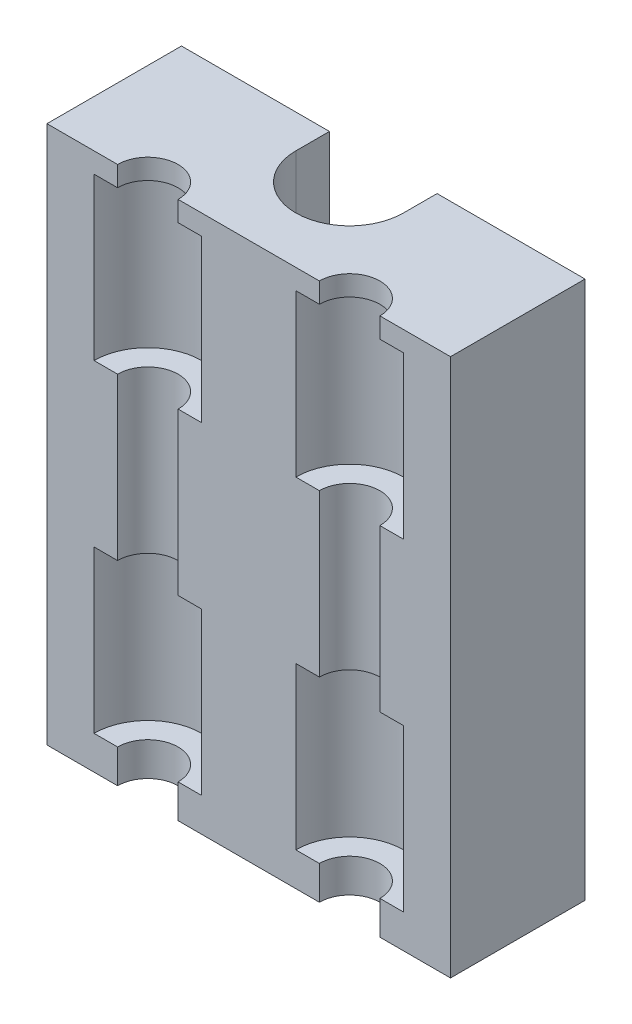
ISO-10303-21;
HEADER;
FILE_DESCRIPTION(('STEP AP214'),'2;1');
FILE_NAME('part.step','',(''),(''),'','','');
FILE_SCHEMA(('AUTOMOTIVE_DESIGN { 1 0 10303 214 1 1 1 1 }'));
ENDSEC;
DATA;
#1=APPLICATION_CONTEXT('core data for automotive mechanical design processes');
#2=APPLICATION_PROTOCOL_DEFINITION('international standard','automotive_design',2000,#1);
#3=PRODUCT_CONTEXT('',#1,'mechanical');
#4=PRODUCT('Part','Part','',(#3));
#5=PRODUCT_RELATED_PRODUCT_CATEGORY('part','',(#4));
#6=PRODUCT_DEFINITION_FORMATION('','',#4);
#7=PRODUCT_DEFINITION_CONTEXT('part definition',#1,'design');
#8=PRODUCT_DEFINITION('design','',#6,#7);
#9=PRODUCT_DEFINITION_SHAPE('','',#8);
#10=(LENGTH_UNIT() NAMED_UNIT(*) SI_UNIT(.MILLI.,.METRE.));
#11=(NAMED_UNIT(*) PLANE_ANGLE_UNIT() SI_UNIT($,.RADIAN.));
#12=(NAMED_UNIT(*) SI_UNIT($,.STERADIAN.) SOLID_ANGLE_UNIT());
#13=UNCERTAINTY_MEASURE_WITH_UNIT(LENGTH_MEASURE(1.E-05),#10,'distance_accuracy_value','');
#14=(GEOMETRIC_REPRESENTATION_CONTEXT(3) GLOBAL_UNCERTAINTY_ASSIGNED_CONTEXT((#13)) GLOBAL_UNIT_ASSIGNED_CONTEXT((#10,
#11,#12)) REPRESENTATION_CONTEXT('',''));
#15=CARTESIAN_POINT('',(0.,0.,0.));
#16=DIRECTION('',(0.,0.,1.));
#17=DIRECTION('',(1.,0.,0.));
#18=AXIS2_PLACEMENT_3D('',#15,#16,#17);
#19=CARTESIAN_POINT('',(-15.,-40.,-10.));
#20=DIRECTION('',(0.,0.,-1.));
#21=DIRECTION('',(-1.,0.,0.));
#22=AXIS2_PLACEMENT_3D('',#19,#20,#21);
#23=PLANE('',#22);
#24=DIRECTION('',(0.,1.,0.));
#25=VECTOR('',#24,1.);
#26=CARTESIAN_POINT('',(-4.,-40.,-10.));
#27=LINE('',#26,#25);
#28=CARTESIAN_POINT('',(-4.,-40.,-10.));
#29=VERTEX_POINT('',#28);
#30=CARTESIAN_POINT('',(-4.,0.,-10.));
#31=VERTEX_POINT('',#30);
#32=EDGE_CURVE('E251',#29,#31,#27,.T.);
#33=ORIENTED_EDGE('',*,*,#32,.F.);
#34=DIRECTION('',(-1.,0.,0.));
#35=VECTOR('',#34,1.);
#36=CARTESIAN_POINT('',(-15.,-40.,-10.));
#37=LINE('',#36,#35);
#38=CARTESIAN_POINT('',(-15.,-40.,-10.));
#39=VERTEX_POINT('',#38);
#40=EDGE_CURVE('E346',#29,#39,#37,.T.);
#41=ORIENTED_EDGE('',*,*,#40,.T.);
#42=DIRECTION('',(0.,1.,0.));
#43=VECTOR('',#42,1.);
#44=CARTESIAN_POINT('',(-15.,-40.,-10.));
#45=LINE('',#44,#43);
#46=CARTESIAN_POINT('',(-15.,0.,-10.));
#47=VERTEX_POINT('',#46);
#48=EDGE_CURVE('E378',#39,#47,#45,.T.);
#49=ORIENTED_EDGE('',*,*,#48,.T.);
#50=DIRECTION('',(-1.,0.,0.));
#51=VECTOR('',#50,1.);
#52=CARTESIAN_POINT('',(-15.,0.,-10.));
#53=LINE('',#52,#51);
#54=EDGE_CURVE('E361',#31,#47,#53,.T.);
#55=ORIENTED_EDGE('',*,*,#54,.F.);
#56=EDGE_LOOP('',(#33,#41,#49,#55));
#57=FACE_BOUND('',#56,.T.);
#58=ADVANCED_FACE('F35',(#57),#23,.T.);
#59=CARTESIAN_POINT('',(-15.,-40.,0.));
#60=DIRECTION('',(0.,0.,1.));
#61=DIRECTION('',(1.,0.,0.));
#62=AXIS2_PLACEMENT_3D('',#59,#60,#61);
#63=PLANE('',#62);
#64=DIRECTION('',(0.,1.,0.));
#65=VECTOR('',#64,1.);
#66=CARTESIAN_POINT('',(-5.25,-40.,0.));
#67=LINE('',#66,#65);
#68=CARTESIAN_POINT('',(-5.25,-40.,0.));
#69=VERTEX_POINT('',#68);
#70=CARTESIAN_POINT('',(-5.25,-37.5,0.));
#71=VERTEX_POINT('',#70);
#72=EDGE_CURVE('E285',#69,#71,#67,.T.);
#73=ORIENTED_EDGE('',*,*,#72,.F.);
#74=DIRECTION('',(1.,0.,0.));
#75=VECTOR('',#74,1.);
#76=CARTESIAN_POINT('',(-15.,-40.,0.));
#77=LINE('',#76,#75);
#78=CARTESIAN_POINT('',(5.25,-40.,0.));
#79=VERTEX_POINT('',#78);
#80=EDGE_CURVE('E358',#69,#79,#77,.T.);
#81=ORIENTED_EDGE('',*,*,#80,.T.);
#82=DIRECTION('',(0.,1.,0.));
#83=VECTOR('',#82,1.);
#84=CARTESIAN_POINT('',(5.25,-40.,0.));
#85=LINE('',#84,#83);
#86=CARTESIAN_POINT('',(5.25,-37.5,0.));
#87=VERTEX_POINT('',#86);
#88=EDGE_CURVE('E266',#87,#79,#85,.F.);
#89=ORIENTED_EDGE('',*,*,#88,.F.);
#90=DIRECTION('',(1.,0.,0.));
#91=VECTOR('',#90,1.);
#92=CARTESIAN_POINT('',(3.5,-37.5,0.));
#93=LINE('',#92,#91);
#94=CARTESIAN_POINT('',(3.5,-37.5,0.));
#95=VERTEX_POINT('',#94);
#96=EDGE_CURVE('E297',#95,#87,#93,.T.);
#97=ORIENTED_EDGE('',*,*,#96,.F.);
#98=DIRECTION('',(0.,1.,0.));
#99=VECTOR('',#98,1.);
#100=CARTESIAN_POINT('',(3.5,-37.5,0.));
#101=LINE('',#100,#99);
#102=CARTESIAN_POINT('',(3.5,-25.5,0.));
#103=VERTEX_POINT('',#102);
#104=EDGE_CURVE('E300',#95,#103,#101,.T.);
#105=ORIENTED_EDGE('',*,*,#104,.T.);
#106=DIRECTION('',(1.,0.,0.));
#107=VECTOR('',#106,1.);
#108=CARTESIAN_POINT('',(3.5,-25.5,0.));
#109=LINE('',#108,#107);
#110=CARTESIAN_POINT('',(5.25,-25.5,0.));
#111=VERTEX_POINT('',#110);
#112=EDGE_CURVE('E296',#103,#111,#109,.T.);
#113=ORIENTED_EDGE('',*,*,#112,.T.);
#114=CARTESIAN_POINT('',(5.25,-13.5,0.));
#115=VERTEX_POINT('',#114);
#116=EDGE_CURVE('E260',#115,#111,#85,.F.);
#117=ORIENTED_EDGE('',*,*,#116,.F.);
#118=DIRECTION('',(1.,0.,0.));
#119=VECTOR('',#118,1.);
#120=CARTESIAN_POINT('',(-15.,-13.5,0.));
#121=LINE('',#120,#119);
#122=CARTESIAN_POINT('',(3.5,-13.5,0.));
#123=VERTEX_POINT('',#122);
#124=EDGE_CURVE('E391',#123,#115,#121,.T.);
#125=ORIENTED_EDGE('',*,*,#124,.F.);
#126=DIRECTION('',(0.,1.,0.));
#127=VECTOR('',#126,1.);
#128=CARTESIAN_POINT('',(3.5,-13.5,0.));
#129=LINE('',#128,#127);
#130=CARTESIAN_POINT('',(3.5,-1.5,0.));
#131=VERTEX_POINT('',#130);
#132=EDGE_CURVE('E385',#131,#123,#129,.F.);
#133=ORIENTED_EDGE('',*,*,#132,.F.);
#134=DIRECTION('',(1.,0.,0.));
#135=VECTOR('',#134,1.);
#136=CARTESIAN_POINT('',(-15.,-1.5,0.));
#137=LINE('',#136,#135);
#138=CARTESIAN_POINT('',(5.25,-1.5,0.));
#139=VERTEX_POINT('',#138);
#140=EDGE_CURVE('E382',#131,#139,#137,.T.);
#141=ORIENTED_EDGE('',*,*,#140,.T.);
#142=CARTESIAN_POINT('',(5.25,0.,0.));
#143=VERTEX_POINT('',#142);
#144=EDGE_CURVE('E58',#143,#139,#85,.F.);
#145=ORIENTED_EDGE('',*,*,#144,.F.);
#146=DIRECTION('',(1.,0.,0.));
#147=VECTOR('',#146,1.);
#148=CARTESIAN_POINT('',(-15.,0.,0.));
#149=LINE('',#148,#147);
#150=CARTESIAN_POINT('',(-5.25,0.,0.));
#151=VERTEX_POINT('',#150);
#152=EDGE_CURVE('E371',#151,#143,#149,.T.);
#153=ORIENTED_EDGE('',*,*,#152,.F.);
#154=CARTESIAN_POINT('',(-5.25,-1.5,0.));
#155=VERTEX_POINT('',#154);
#156=EDGE_CURVE('E284',#155,#151,#67,.T.);
#157=ORIENTED_EDGE('',*,*,#156,.F.);
#158=DIRECTION('',(-1.,0.,0.));
#159=VECTOR('',#158,1.);
#160=CARTESIAN_POINT('',(-15.,-1.5,0.));
#161=LINE('',#160,#159);
#162=CARTESIAN_POINT('',(-3.5,-1.5,0.));
#163=VERTEX_POINT('',#162);
#164=EDGE_CURVE('E395',#163,#155,#161,.T.);
#165=ORIENTED_EDGE('',*,*,#164,.F.);
#166=DIRECTION('',(0.,1.,0.));
#167=VECTOR('',#166,1.);
#168=CARTESIAN_POINT('',(-3.5,-13.5,0.));
#169=LINE('',#168,#167);
#170=CARTESIAN_POINT('',(-3.5,-13.5,0.));
#171=VERTEX_POINT('',#170);
#172=EDGE_CURVE('E401',#171,#163,#169,.T.);
#173=ORIENTED_EDGE('',*,*,#172,.F.);
#174=DIRECTION('',(-1.,0.,0.));
#175=VECTOR('',#174,1.);
#176=CARTESIAN_POINT('',(-15.,-13.5,0.));
#177=LINE('',#176,#175);
#178=CARTESIAN_POINT('',(-5.25,-13.5,0.));
#179=VERTEX_POINT('',#178);
#180=EDGE_CURVE('E405',#171,#179,#177,.T.);
#181=ORIENTED_EDGE('',*,*,#180,.T.);
#182=CARTESIAN_POINT('',(-5.25,-25.5,0.));
#183=VERTEX_POINT('',#182);
#184=EDGE_CURVE('E279',#183,#179,#67,.T.);
#185=ORIENTED_EDGE('',*,*,#184,.F.);
#186=DIRECTION('',(1.,0.,0.));
#187=VECTOR('',#186,1.);
#188=CARTESIAN_POINT('',(-11.5,-25.5,0.));
#189=LINE('',#188,#187);
#190=CARTESIAN_POINT('',(-3.5,-25.5,0.));
#191=VERTEX_POINT('',#190);
#192=EDGE_CURVE('E324',#183,#191,#189,.T.);
#193=ORIENTED_EDGE('',*,*,#192,.T.);
#194=DIRECTION('',(0.,1.,0.));
#195=VECTOR('',#194,1.);
#196=CARTESIAN_POINT('',(-3.5,-37.5,0.));
#197=LINE('',#196,#195);
#198=CARTESIAN_POINT('',(-3.5,-37.5,0.));
#199=VERTEX_POINT('',#198);
#200=EDGE_CURVE('E304',#199,#191,#197,.T.);
#201=ORIENTED_EDGE('',*,*,#200,.F.);
#202=DIRECTION('',(1.,0.,0.));
#203=VECTOR('',#202,1.);
#204=CARTESIAN_POINT('',(-11.5,-37.5,0.));
#205=LINE('',#204,#203);
#206=EDGE_CURVE('E316',#71,#199,#205,.T.);
#207=ORIENTED_EDGE('',*,*,#206,.F.);
#208=EDGE_LOOP('',(#73,#81,#89,#97,#105,#113,#117,#125,#133,#141,#145,#153,#157,#165,#173,#181,
#185,#193,#201,#207));
#209=FACE_BOUND('',#208,.T.);
#210=ADVANCED_FACE('F418',(#209),#63,.T.);
#211=DIRECTION('',(0.,1.,0.));
#212=VECTOR('',#211,1.);
#213=CARTESIAN_POINT('',(9.75,-40.,0.));
#214=LINE('',#213,#212);
#215=CARTESIAN_POINT('',(9.75,-40.,0.));
#216=VERTEX_POINT('',#215);
#217=CARTESIAN_POINT('',(9.75,-37.5,0.));
#218=VERTEX_POINT('',#217);
#219=EDGE_CURVE('E270',#216,#218,#214,.T.);
#220=ORIENTED_EDGE('',*,*,#219,.F.);
#221=CARTESIAN_POINT('',(15.,-40.,0.));
#222=VERTEX_POINT('',#221);
#223=EDGE_CURVE('E353',#216,#222,#77,.T.);
#224=ORIENTED_EDGE('',*,*,#223,.T.);
#225=DIRECTION('',(0.,1.,0.));
#226=VECTOR('',#225,1.);
#227=CARTESIAN_POINT('',(15.,-40.,0.));
#228=LINE('',#227,#226);
#229=CARTESIAN_POINT('',(15.,0.,0.));
#230=VERTEX_POINT('',#229);
#231=EDGE_CURVE('E372',#222,#230,#228,.T.);
#232=ORIENTED_EDGE('',*,*,#231,.T.);
#233=CARTESIAN_POINT('',(9.75,0.,0.));
#234=VERTEX_POINT('',#233);
#235=EDGE_CURVE('E368',#234,#230,#149,.T.);
#236=ORIENTED_EDGE('',*,*,#235,.F.);
#237=CARTESIAN_POINT('',(9.75,-1.5,0.));
#238=VERTEX_POINT('',#237);
#239=EDGE_CURVE('E269',#238,#234,#214,.T.);
#240=ORIENTED_EDGE('',*,*,#239,.F.);
#241=CARTESIAN_POINT('',(11.5,-1.5,0.));
#242=VERTEX_POINT('',#241);
#243=EDGE_CURVE('E375',#238,#242,#137,.T.);
#244=ORIENTED_EDGE('',*,*,#243,.T.);
#245=DIRECTION('',(0.,1.,0.));
#246=VECTOR('',#245,1.);
#247=CARTESIAN_POINT('',(11.5,-13.5,0.));
#248=LINE('',#247,#246);
#249=CARTESIAN_POINT('',(11.5,-13.5,0.));
#250=VERTEX_POINT('',#249);
#251=EDGE_CURVE('E387',#250,#242,#248,.T.);
#252=ORIENTED_EDGE('',*,*,#251,.F.);
#253=CARTESIAN_POINT('',(9.75,-13.5,0.));
#254=VERTEX_POINT('',#253);
#255=EDGE_CURVE('E390',#254,#250,#121,.T.);
#256=ORIENTED_EDGE('',*,*,#255,.F.);
#257=CARTESIAN_POINT('',(9.75,-25.5,0.));
#258=VERTEX_POINT('',#257);
#259=EDGE_CURVE('E265',#258,#254,#214,.T.);
#260=ORIENTED_EDGE('',*,*,#259,.F.);
#261=CARTESIAN_POINT('',(11.5,-25.5,0.));
#262=VERTEX_POINT('',#261);
#263=EDGE_CURVE('E303',#258,#262,#109,.T.);
#264=ORIENTED_EDGE('',*,*,#263,.T.);
#265=DIRECTION('',(0.,1.,0.));
#266=VECTOR('',#265,1.);
#267=CARTESIAN_POINT('',(11.5,-37.5,0.));
#268=LINE('',#267,#266);
#269=CARTESIAN_POINT('',(11.5,-37.5,0.));
#270=VERTEX_POINT('',#269);
#271=EDGE_CURVE('E307',#270,#262,#268,.T.);
#272=ORIENTED_EDGE('',*,*,#271,.F.);
#273=EDGE_CURVE('E295',#218,#270,#93,.T.);
#274=ORIENTED_EDGE('',*,*,#273,.F.);
#275=EDGE_LOOP('',(#220,#224,#232,#236,#240,#244,#252,#256,#260,#264,#272,#274));
#276=FACE_BOUND('',#275,.T.);
#277=ADVANCED_FACE('F432',(#276),#63,.T.);
#278=DIRECTION('',(0.,1.,0.));
#279=VECTOR('',#278,1.);
#280=CARTESIAN_POINT('',(-9.75,-40.,0.));
#281=LINE('',#280,#279);
#282=CARTESIAN_POINT('',(-9.75,0.,0.));
#283=VERTEX_POINT('',#282);
#284=CARTESIAN_POINT('',(-9.75,-1.5,0.));
#285=VERTEX_POINT('',#284);
#286=EDGE_CURVE('E280',#283,#285,#281,.F.);
#287=ORIENTED_EDGE('',*,*,#286,.F.);
#288=CARTESIAN_POINT('',(-15.,0.,0.));
#289=VERTEX_POINT('',#288);
#290=EDGE_CURVE('E347',#289,#283,#149,.T.);
#291=ORIENTED_EDGE('',*,*,#290,.F.);
#292=DIRECTION('',(0.,1.,0.));
#293=VECTOR('',#292,1.);
#294=CARTESIAN_POINT('',(-15.,-40.,0.));
#295=LINE('',#294,#293);
#296=CARTESIAN_POINT('',(-15.,-40.,0.));
#297=VERTEX_POINT('',#296);
#298=EDGE_CURVE('E376',#297,#289,#295,.T.);
#299=ORIENTED_EDGE('',*,*,#298,.F.);
#300=CARTESIAN_POINT('',(-9.75,-40.,0.));
#301=VERTEX_POINT('',#300);
#302=EDGE_CURVE('E354',#297,#301,#77,.T.);
#303=ORIENTED_EDGE('',*,*,#302,.T.);
#304=CARTESIAN_POINT('',(-9.75,-37.5,0.));
#305=VERTEX_POINT('',#304);
#306=EDGE_CURVE('E281',#305,#301,#281,.F.);
#307=ORIENTED_EDGE('',*,*,#306,.F.);
#308=CARTESIAN_POINT('',(-11.5,-37.5,0.));
#309=VERTEX_POINT('',#308);
#310=EDGE_CURVE('E318',#309,#305,#205,.T.);
#311=ORIENTED_EDGE('',*,*,#310,.F.);
#312=DIRECTION('',(0.,1.,0.));
#313=VECTOR('',#312,1.);
#314=CARTESIAN_POINT('',(-11.5,-37.5,0.));
#315=LINE('',#314,#313);
#316=CARTESIAN_POINT('',(-11.5,-25.5,0.));
#317=VERTEX_POINT('',#316);
#318=EDGE_CURVE('E321',#309,#317,#315,.T.);
#319=ORIENTED_EDGE('',*,*,#318,.T.);
#320=CARTESIAN_POINT('',(-9.75,-25.5,0.));
#321=VERTEX_POINT('',#320);
#322=EDGE_CURVE('E317',#317,#321,#189,.T.);
#323=ORIENTED_EDGE('',*,*,#322,.T.);
#324=CARTESIAN_POINT('',(-9.75,-13.5,0.));
#325=VERTEX_POINT('',#324);
#326=EDGE_CURVE('E277',#325,#321,#281,.F.);
#327=ORIENTED_EDGE('',*,*,#326,.F.);
#328=CARTESIAN_POINT('',(-11.5,-13.5,0.));
#329=VERTEX_POINT('',#328);
#330=EDGE_CURVE('E404',#325,#329,#177,.T.);
#331=ORIENTED_EDGE('',*,*,#330,.T.);
#332=DIRECTION('',(0.,1.,0.));
#333=VECTOR('',#332,1.);
#334=CARTESIAN_POINT('',(-11.5,-13.5,0.));
#335=LINE('',#334,#333);
#336=CARTESIAN_POINT('',(-11.5,-1.5,0.));
#337=VERTEX_POINT('',#336);
#338=EDGE_CURVE('E398',#337,#329,#335,.F.);
#339=ORIENTED_EDGE('',*,*,#338,.F.);
#340=EDGE_CURVE('E394',#285,#337,#161,.T.);
#341=ORIENTED_EDGE('',*,*,#340,.F.);
#342=EDGE_LOOP('',(#287,#291,#299,#303,#307,#311,#319,#323,#327,#331,#339,#341));
#343=FACE_BOUND('',#342,.T.);
#344=ADVANCED_FACE('F491',(#343),#63,.T.);
#345=CARTESIAN_POINT('',(15.,-40.,-10.));
#346=DIRECTION('',(1.,0.,0.));
#347=DIRECTION('',(0.,0.,-1.));
#348=AXIS2_PLACEMENT_3D('',#345,#346,#347);
#349=PLANE('',#348);
#350=DIRECTION('',(0.,0.,-1.));
#351=VECTOR('',#350,1.);
#352=CARTESIAN_POINT('',(15.,0.,-10.));
#353=LINE('',#352,#351);
#354=CARTESIAN_POINT('',(15.,0.,-10.));
#355=VERTEX_POINT('',#354);
#356=EDGE_CURVE('E334',#230,#355,#353,.T.);
#357=ORIENTED_EDGE('',*,*,#356,.F.);
#358=ORIENTED_EDGE('',*,*,#231,.F.);
#359=DIRECTION('',(0.,0.,-1.));
#360=VECTOR('',#359,1.);
#361=CARTESIAN_POINT('',(15.,-40.,-10.));
#362=LINE('',#361,#360);
#363=CARTESIAN_POINT('',(15.,-40.,-10.));
#364=VERTEX_POINT('',#363);
#365=EDGE_CURVE('E343',#222,#364,#362,.T.);
#366=ORIENTED_EDGE('',*,*,#365,.T.);
#367=DIRECTION('',(0.,1.,0.));
#368=VECTOR('',#367,1.);
#369=CARTESIAN_POINT('',(15.,-40.,-10.));
#370=LINE('',#369,#368);
#371=EDGE_CURVE('E357',#364,#355,#370,.T.);
#372=ORIENTED_EDGE('',*,*,#371,.T.);
#373=EDGE_LOOP('',(#357,#358,#366,#372));
#374=FACE_BOUND('',#373,.T.);
#375=ADVANCED_FACE('F37',(#374),#349,.T.);
#376=CARTESIAN_POINT('',(-15.,-40.,-10.));
#377=DIRECTION('',(-1.,0.,0.));
#378=DIRECTION('',(0.,0.,1.));
#379=AXIS2_PLACEMENT_3D('',#376,#377,#378);
#380=PLANE('',#379);
#381=DIRECTION('',(0.,0.,1.));
#382=VECTOR('',#381,1.);
#383=CARTESIAN_POINT('',(-15.,0.,-10.));
#384=LINE('',#383,#382);
#385=EDGE_CURVE('E365',#47,#289,#384,.T.);
#386=ORIENTED_EDGE('',*,*,#385,.F.);
#387=ORIENTED_EDGE('',*,*,#48,.F.);
#388=DIRECTION('',(0.,0.,1.));
#389=VECTOR('',#388,1.);
#390=CARTESIAN_POINT('',(-15.,-40.,-10.));
#391=LINE('',#390,#389);
#392=EDGE_CURVE('E350',#39,#297,#391,.T.);
#393=ORIENTED_EDGE('',*,*,#392,.T.);
#394=ORIENTED_EDGE('',*,*,#298,.T.);
#395=EDGE_LOOP('',(#386,#387,#393,#394));
#396=FACE_BOUND('',#395,.T.);
#397=ADVANCED_FACE('F513',(#396),#380,.T.);
#398=DIRECTION('',(0.,1.,0.));
#399=VECTOR('',#398,1.);
#400=CARTESIAN_POINT('',(4.,-40.,-10.));
#401=LINE('',#400,#399);
#402=CARTESIAN_POINT('',(4.,-40.,-10.));
#403=VERTEX_POINT('',#402);
#404=CARTESIAN_POINT('',(4.,0.,-10.));
#405=VERTEX_POINT('',#404);
#406=EDGE_CURVE('E226',#403,#405,#401,.T.);
#407=ORIENTED_EDGE('',*,*,#406,.T.);
#408=EDGE_CURVE('E362',#355,#405,#53,.T.);
#409=ORIENTED_EDGE('',*,*,#408,.F.);
#410=ORIENTED_EDGE('',*,*,#371,.F.);
#411=EDGE_CURVE('E348',#364,#403,#37,.T.);
#412=ORIENTED_EDGE('',*,*,#411,.T.);
#413=EDGE_LOOP('',(#407,#409,#410,#412));
#414=FACE_BOUND('',#413,.T.);
#415=ADVANCED_FACE('F461',(#414),#23,.T.);
#416=CARTESIAN_POINT('',(0.,-40.,0.));
#417=DIRECTION('',(0.,1.,0.));
#418=DIRECTION('',(0.,0.,1.));
#419=AXIS2_PLACEMENT_3D('',#416,#417,#418);
#420=PLANE('',#419);
#421=ORIENTED_EDGE('',*,*,#40,.F.);
#422=DIRECTION('',(0.,0.,1.));
#423=VECTOR('',#422,1.);
#424=CARTESIAN_POINT('',(-4.,-40.,-7.5));
#425=LINE('',#424,#423);
#426=CARTESIAN_POINT('',(-4.,-40.,-7.5));
#427=VERTEX_POINT('',#426);
#428=EDGE_CURVE('E227',#29,#427,#425,.T.);
#429=ORIENTED_EDGE('',*,*,#428,.T.);
#430=CARTESIAN_POINT('',(0.,-40.,-7.5));
#431=DIRECTION('',(0.,1.,0.));
#432=DIRECTION('',(0.,0.,1.));
#433=AXIS2_PLACEMENT_3D('',#430,#431,#432);
#434=CIRCLE('',#433,4.);
#435=CARTESIAN_POINT('',(4.,-40.,-7.5));
#436=VERTEX_POINT('',#435);
#437=EDGE_CURVE('E222',#427,#436,#434,.T.);
#438=ORIENTED_EDGE('',*,*,#437,.T.);
#439=DIRECTION('',(0.,0.,-1.));
#440=VECTOR('',#439,1.);
#441=CARTESIAN_POINT('',(4.,-40.,-7.5));
#442=LINE('',#441,#440);
#443=EDGE_CURVE('E230',#436,#403,#442,.T.);
#444=ORIENTED_EDGE('',*,*,#443,.T.);
#445=ORIENTED_EDGE('',*,*,#411,.F.);
#446=ORIENTED_EDGE('',*,*,#365,.F.);
#447=ORIENTED_EDGE('',*,*,#223,.F.);
#448=CARTESIAN_POINT('',(7.5,-40.,0.));
#449=DIRECTION('',(0.,1.,0.));
#450=DIRECTION('',(0.,0.,1.));
#451=AXIS2_PLACEMENT_3D('',#448,#449,#450);
#452=CIRCLE('',#451,2.25);
#453=EDGE_CURVE('E257',#216,#79,#452,.T.);
#454=ORIENTED_EDGE('',*,*,#453,.T.);
#455=ORIENTED_EDGE('',*,*,#80,.F.);
#456=CARTESIAN_POINT('',(-7.5,-40.,0.));
#457=DIRECTION('',(0.,1.,0.));
#458=DIRECTION('',(0.,0.,1.));
#459=AXIS2_PLACEMENT_3D('',#456,#457,#458);
#460=CIRCLE('',#459,2.25);
#461=EDGE_CURVE('E256',#69,#301,#460,.T.);
#462=ORIENTED_EDGE('',*,*,#461,.T.);
#463=ORIENTED_EDGE('',*,*,#302,.F.);
#464=ORIENTED_EDGE('',*,*,#392,.F.);
#465=EDGE_LOOP('',(#421,#429,#438,#444,#445,#446,#447,#454,#455,#462,#463,#464));
#466=FACE_BOUND('',#465,.T.);
#467=ADVANCED_FACE('F238',(#466),#420,.F.);
#468=CARTESIAN_POINT('',(0.,0.,0.));
#469=DIRECTION('',(0.,1.,0.));
#470=DIRECTION('',(0.,0.,1.));
#471=AXIS2_PLACEMENT_3D('',#468,#469,#470);
#472=PLANE('',#471);
#473=DIRECTION('',(0.,0.,1.));
#474=VECTOR('',#473,1.);
#475=CARTESIAN_POINT('',(-4.,0.,-7.5));
#476=LINE('',#475,#474);
#477=CARTESIAN_POINT('',(-4.,0.,-7.5));
#478=VERTEX_POINT('',#477);
#479=EDGE_CURVE('E239',#31,#478,#476,.T.);
#480=ORIENTED_EDGE('',*,*,#479,.F.);
#481=ORIENTED_EDGE('',*,*,#54,.T.);
#482=ORIENTED_EDGE('',*,*,#385,.T.);
#483=ORIENTED_EDGE('',*,*,#290,.T.);
#484=CARTESIAN_POINT('',(-7.5,0.,0.));
#485=DIRECTION('',(0.,1.,0.));
#486=DIRECTION('',(0.,0.,1.));
#487=AXIS2_PLACEMENT_3D('',#484,#485,#486);
#488=CIRCLE('',#487,2.25);
#489=EDGE_CURVE('E254',#151,#283,#488,.T.);
#490=ORIENTED_EDGE('',*,*,#489,.F.);
#491=ORIENTED_EDGE('',*,*,#152,.T.);
#492=CARTESIAN_POINT('',(7.5,0.,0.));
#493=DIRECTION('',(0.,1.,0.));
#494=DIRECTION('',(0.,0.,1.));
#495=AXIS2_PLACEMENT_3D('',#492,#493,#494);
#496=CIRCLE('',#495,2.25);
#497=EDGE_CURVE('E250',#234,#143,#496,.T.);
#498=ORIENTED_EDGE('',*,*,#497,.F.);
#499=ORIENTED_EDGE('',*,*,#235,.T.);
#500=ORIENTED_EDGE('',*,*,#356,.T.);
#501=ORIENTED_EDGE('',*,*,#408,.T.);
#502=DIRECTION('',(0.,0.,-1.));
#503=VECTOR('',#502,1.);
#504=CARTESIAN_POINT('',(4.,0.,-7.5));
#505=LINE('',#504,#503);
#506=CARTESIAN_POINT('',(4.,0.,-7.5));
#507=VERTEX_POINT('',#506);
#508=EDGE_CURVE('E242',#507,#405,#505,.T.);
#509=ORIENTED_EDGE('',*,*,#508,.F.);
#510=CARTESIAN_POINT('',(0.,0.,-7.5));
#511=DIRECTION('',(0.,1.,0.));
#512=DIRECTION('',(0.,0.,1.));
#513=AXIS2_PLACEMENT_3D('',#510,#511,#512);
#514=CIRCLE('',#513,4.);
#515=EDGE_CURVE('E50',#478,#507,#514,.T.);
#516=ORIENTED_EDGE('',*,*,#515,.F.);
#517=EDGE_LOOP('',(#480,#481,#482,#483,#490,#491,#498,#499,#500,#501,#509,#516));
#518=FACE_BOUND('',#517,.T.);
#519=ADVANCED_FACE('F465',(#518),#472,.T.);
#520=CARTESIAN_POINT('',(7.5,-13.5,0.));
#521=DIRECTION('',(0.,1.,0.));
#522=DIRECTION('',(0.,0.,1.));
#523=AXIS2_PLACEMENT_3D('',#520,#521,#522);
#524=CYLINDRICAL_SURFACE('',#523,4.);
#525=ORIENTED_EDGE('',*,*,#251,.T.);
#526=CARTESIAN_POINT('',(7.5,-1.5,0.));
#527=DIRECTION('',(0.,1.,0.));
#528=DIRECTION('',(0.,0.,-1.));
#529=AXIS2_PLACEMENT_3D('',#526,#527,#528);
#530=CIRCLE('',#529,4.);
#531=EDGE_CURVE('E310',#242,#131,#530,.T.);
#532=ORIENTED_EDGE('',*,*,#531,.T.);
#533=ORIENTED_EDGE('',*,*,#132,.T.);
#534=CARTESIAN_POINT('',(7.5,-13.5,0.));
#535=DIRECTION('',(0.,1.,0.));
#536=DIRECTION('',(0.,0.,-1.));
#537=AXIS2_PLACEMENT_3D('',#534,#535,#536);
#538=CIRCLE('',#537,4.);
#539=EDGE_CURVE('E338',#250,#123,#538,.T.);
#540=ORIENTED_EDGE('',*,*,#539,.F.);
#541=EDGE_LOOP('',(#525,#532,#533,#540));
#542=FACE_BOUND('',#541,.T.);
#543=ADVANCED_FACE('F442',(#542),#524,.F.);
#544=CARTESIAN_POINT('',(7.5,-13.5,0.));
#545=DIRECTION('',(0.,-1.,0.));
#546=DIRECTION('',(0.,0.,-1.));
#547=AXIS2_PLACEMENT_3D('',#544,#545,#546);
#548=PLANE('',#547);
#549=ORIENTED_EDGE('',*,*,#124,.T.);
#550=CARTESIAN_POINT('',(7.5,-13.5,0.));
#551=DIRECTION('',(0.,-1.,0.));
#552=DIRECTION('',(0.,0.,-1.));
#553=AXIS2_PLACEMENT_3D('',#550,#551,#552);
#554=CIRCLE('',#553,2.25);
#555=EDGE_CURVE('E268',#115,#254,#554,.T.);
#556=ORIENTED_EDGE('',*,*,#555,.T.);
#557=ORIENTED_EDGE('',*,*,#255,.T.);
#558=ORIENTED_EDGE('',*,*,#539,.T.);
#559=EDGE_LOOP('',(#549,#556,#557,#558));
#560=FACE_BOUND('',#559,.T.);
#561=ADVANCED_FACE('F438',(#560),#548,.F.);
#562=CARTESIAN_POINT('',(7.5,-1.5,0.));
#563=DIRECTION('',(0.,-1.,0.));
#564=DIRECTION('',(0.,0.,-1.));
#565=AXIS2_PLACEMENT_3D('',#562,#563,#564);
#566=PLANE('',#565);
#567=CARTESIAN_POINT('',(7.5,-1.5,0.));
#568=DIRECTION('',(0.,-1.,0.));
#569=DIRECTION('',(0.,0.,-1.));
#570=AXIS2_PLACEMENT_3D('',#567,#568,#569);
#571=CIRCLE('',#570,2.25);
#572=EDGE_CURVE('E275',#139,#238,#571,.T.);
#573=ORIENTED_EDGE('',*,*,#572,.F.);
#574=ORIENTED_EDGE('',*,*,#140,.F.);
#575=ORIENTED_EDGE('',*,*,#531,.F.);
#576=ORIENTED_EDGE('',*,*,#243,.F.);
#577=EDGE_LOOP('',(#573,#574,#575,#576));
#578=FACE_BOUND('',#577,.T.);
#579=ADVANCED_FACE('F446',(#578),#566,.T.);
#580=CARTESIAN_POINT('',(-7.5,-13.5,0.));
#581=DIRECTION('',(0.,1.,0.));
#582=DIRECTION('',(0.,0.,1.));
#583=AXIS2_PLACEMENT_3D('',#580,#581,#582);
#584=CYLINDRICAL_SURFACE('',#583,4.);
#585=ORIENTED_EDGE('',*,*,#172,.T.);
#586=CARTESIAN_POINT('',(-7.5,-1.5,0.));
#587=DIRECTION('',(0.,1.,0.));
#588=DIRECTION('',(0.,0.,1.));
#589=AXIS2_PLACEMENT_3D('',#586,#587,#588);
#590=CIRCLE('',#589,4.);
#591=EDGE_CURVE('E335',#163,#337,#590,.T.);
#592=ORIENTED_EDGE('',*,*,#591,.T.);
#593=ORIENTED_EDGE('',*,*,#338,.T.);
#594=CARTESIAN_POINT('',(-7.5,-13.5,0.));
#595=DIRECTION('',(0.,1.,0.));
#596=DIRECTION('',(0.,0.,1.));
#597=AXIS2_PLACEMENT_3D('',#594,#595,#596);
#598=CIRCLE('',#597,4.);
#599=EDGE_CURVE('E331',#171,#329,#598,.T.);
#600=ORIENTED_EDGE('',*,*,#599,.F.);
#601=EDGE_LOOP('',(#585,#592,#593,#600));
#602=FACE_BOUND('',#601,.T.);
#603=ADVANCED_FACE('F479',(#602),#584,.F.);
#604=CARTESIAN_POINT('',(-7.5,-13.5,0.));
#605=DIRECTION('',(0.,1.,0.));
#606=DIRECTION('',(0.,0.,1.));
#607=AXIS2_PLACEMENT_3D('',#604,#605,#606);
#608=PLANE('',#607);
#609=CARTESIAN_POINT('',(-7.5,-13.5,0.));
#610=DIRECTION('',(0.,1.,0.));
#611=DIRECTION('',(0.,0.,1.));
#612=AXIS2_PLACEMENT_3D('',#609,#610,#611);
#613=CIRCLE('',#612,2.25);
#614=EDGE_CURVE('E283',#179,#325,#613,.T.);
#615=ORIENTED_EDGE('',*,*,#614,.F.);
#616=ORIENTED_EDGE('',*,*,#180,.F.);
#617=ORIENTED_EDGE('',*,*,#599,.T.);
#618=ORIENTED_EDGE('',*,*,#330,.F.);
#619=EDGE_LOOP('',(#615,#616,#617,#618));
#620=FACE_BOUND('',#619,.T.);
#621=ADVANCED_FACE('F484',(#620),#608,.T.);
#622=CARTESIAN_POINT('',(-7.5,-1.5,0.));
#623=DIRECTION('',(0.,1.,0.));
#624=DIRECTION('',(0.,0.,1.));
#625=AXIS2_PLACEMENT_3D('',#622,#623,#624);
#626=PLANE('',#625);
#627=ORIENTED_EDGE('',*,*,#164,.T.);
#628=CARTESIAN_POINT('',(-7.5,-1.5,0.));
#629=DIRECTION('',(0.,1.,0.));
#630=DIRECTION('',(0.,0.,1.));
#631=AXIS2_PLACEMENT_3D('',#628,#629,#630);
#632=CIRCLE('',#631,2.25);
#633=EDGE_CURVE('E289',#155,#285,#632,.T.);
#634=ORIENTED_EDGE('',*,*,#633,.T.);
#635=ORIENTED_EDGE('',*,*,#340,.T.);
#636=ORIENTED_EDGE('',*,*,#591,.F.);
#637=EDGE_LOOP('',(#627,#634,#635,#636));
#638=FACE_BOUND('',#637,.T.);
#639=ADVANCED_FACE('F474',(#638),#626,.F.);
#640=CARTESIAN_POINT('',(-7.5,-37.5,0.));
#641=DIRECTION('',(0.,1.,0.));
#642=DIRECTION('',(0.,0.,1.));
#643=AXIS2_PLACEMENT_3D('',#640,#641,#642);
#644=CYLINDRICAL_SURFACE('',#643,4.);
#645=CARTESIAN_POINT('',(-7.5,-25.5,0.));
#646=DIRECTION('',(0.,1.,0.));
#647=DIRECTION('',(0.,0.,1.));
#648=AXIS2_PLACEMENT_3D('',#645,#646,#647);
#649=CIRCLE('',#648,4.);
#650=EDGE_CURVE('E322',#191,#317,#649,.T.);
#651=ORIENTED_EDGE('',*,*,#650,.T.);
#652=ORIENTED_EDGE('',*,*,#318,.F.);
#653=CARTESIAN_POINT('',(-7.5,-37.5,0.));
#654=DIRECTION('',(0.,1.,0.));
#655=DIRECTION('',(0.,0.,1.));
#656=AXIS2_PLACEMENT_3D('',#653,#654,#655);
#657=CIRCLE('',#656,4.);
#658=EDGE_CURVE('E313',#199,#309,#657,.T.);
#659=ORIENTED_EDGE('',*,*,#658,.F.);
#660=ORIENTED_EDGE('',*,*,#200,.T.);
#661=EDGE_LOOP('',(#651,#652,#659,#660));
#662=FACE_BOUND('',#661,.T.);
#663=ADVANCED_FACE('F500',(#662),#644,.F.);
#664=CARTESIAN_POINT('',(-7.5,-37.5,0.));
#665=DIRECTION('',(0.,1.,0.));
#666=DIRECTION('',(0.,0.,1.));
#667=AXIS2_PLACEMENT_3D('',#664,#665,#666);
#668=PLANE('',#667);
#669=CARTESIAN_POINT('',(-7.5,-37.5,0.));
#670=DIRECTION('',(0.,1.,0.));
#671=DIRECTION('',(0.,0.,1.));
#672=AXIS2_PLACEMENT_3D('',#669,#670,#671);
#673=CIRCLE('',#672,2.25);
#674=EDGE_CURVE('E287',#71,#305,#673,.T.);
#675=ORIENTED_EDGE('',*,*,#674,.F.);
#676=ORIENTED_EDGE('',*,*,#206,.T.);
#677=ORIENTED_EDGE('',*,*,#658,.T.);
#678=ORIENTED_EDGE('',*,*,#310,.T.);
#679=EDGE_LOOP('',(#675,#676,#677,#678));
#680=FACE_BOUND('',#679,.T.);
#681=ADVANCED_FACE('F503',(#680),#668,.T.);
#682=CARTESIAN_POINT('',(-7.5,-25.5,0.));
#683=DIRECTION('',(0.,1.,0.));
#684=DIRECTION('',(0.,0.,1.));
#685=AXIS2_PLACEMENT_3D('',#682,#683,#684);
#686=PLANE('',#685);
#687=ORIENTED_EDGE('',*,*,#192,.F.);
#688=CARTESIAN_POINT('',(-7.5,-25.5,0.));
#689=DIRECTION('',(0.,1.,0.));
#690=DIRECTION('',(0.,0.,1.));
#691=AXIS2_PLACEMENT_3D('',#688,#689,#690);
#692=CIRCLE('',#691,2.25);
#693=EDGE_CURVE('E11',#183,#321,#692,.T.);
#694=ORIENTED_EDGE('',*,*,#693,.T.);
#695=ORIENTED_EDGE('',*,*,#322,.F.);
#696=ORIENTED_EDGE('',*,*,#650,.F.);
#697=EDGE_LOOP('',(#687,#694,#695,#696));
#698=FACE_BOUND('',#697,.T.);
#699=ADVANCED_FACE('F496',(#698),#686,.F.);
#700=CARTESIAN_POINT('',(7.5,-37.5,0.));
#701=DIRECTION('',(0.,1.,0.));
#702=DIRECTION('',(0.,0.,1.));
#703=AXIS2_PLACEMENT_3D('',#700,#701,#702);
#704=CYLINDRICAL_SURFACE('',#703,4.);
#705=CARTESIAN_POINT('',(7.5,-25.5,0.));
#706=DIRECTION('',(0.,1.,0.));
#707=DIRECTION('',(0.,0.,1.));
#708=AXIS2_PLACEMENT_3D('',#705,#706,#707);
#709=CIRCLE('',#708,4.);
#710=EDGE_CURVE('E301',#262,#103,#709,.T.);
#711=ORIENTED_EDGE('',*,*,#710,.T.);
#712=ORIENTED_EDGE('',*,*,#104,.F.);
#713=CARTESIAN_POINT('',(7.5,-37.5,0.));
#714=DIRECTION('',(0.,1.,0.));
#715=DIRECTION('',(0.,0.,1.));
#716=AXIS2_PLACEMENT_3D('',#713,#714,#715);
#717=CIRCLE('',#716,4.);
#718=EDGE_CURVE('E292',#270,#95,#717,.T.);
#719=ORIENTED_EDGE('',*,*,#718,.F.);
#720=ORIENTED_EDGE('',*,*,#271,.T.);
#721=EDGE_LOOP('',(#711,#712,#719,#720));
#722=FACE_BOUND('',#721,.T.);
#723=ADVANCED_FACE('F424',(#722),#704,.F.);
#724=CARTESIAN_POINT('',(7.5,-37.5,0.));
#725=DIRECTION('',(0.,1.,0.));
#726=DIRECTION('',(0.,0.,1.));
#727=AXIS2_PLACEMENT_3D('',#724,#725,#726);
#728=PLANE('',#727);
#729=CARTESIAN_POINT('',(7.5,-37.5,0.));
#730=DIRECTION('',(0.,1.,0.));
#731=DIRECTION('',(0.,0.,1.));
#732=AXIS2_PLACEMENT_3D('',#729,#730,#731);
#733=CIRCLE('',#732,2.25);
#734=EDGE_CURVE('E273',#218,#87,#733,.T.);
#735=ORIENTED_EDGE('',*,*,#734,.F.);
#736=ORIENTED_EDGE('',*,*,#273,.T.);
#737=ORIENTED_EDGE('',*,*,#718,.T.);
#738=ORIENTED_EDGE('',*,*,#96,.T.);
#739=EDGE_LOOP('',(#735,#736,#737,#738));
#740=FACE_BOUND('',#739,.T.);
#741=ADVANCED_FACE('F428',(#740),#728,.T.);
#742=CARTESIAN_POINT('',(7.5,-25.5,0.));
#743=DIRECTION('',(0.,1.,0.));
#744=DIRECTION('',(0.,0.,1.));
#745=AXIS2_PLACEMENT_3D('',#742,#743,#744);
#746=PLANE('',#745);
#747=ORIENTED_EDGE('',*,*,#263,.F.);
#748=CARTESIAN_POINT('',(7.5,-25.5,0.));
#749=DIRECTION('',(0.,1.,0.));
#750=DIRECTION('',(0.,0.,1.));
#751=AXIS2_PLACEMENT_3D('',#748,#749,#750);
#752=CIRCLE('',#751,2.25);
#753=EDGE_CURVE('E43',#258,#111,#752,.T.);
#754=ORIENTED_EDGE('',*,*,#753,.T.);
#755=ORIENTED_EDGE('',*,*,#112,.F.);
#756=ORIENTED_EDGE('',*,*,#710,.F.);
#757=EDGE_LOOP('',(#747,#754,#755,#756));
#758=FACE_BOUND('',#757,.T.);
#759=ADVANCED_FACE('F411',(#758),#746,.F.);
#760=CARTESIAN_POINT('',(7.5,-40.,0.));
#761=DIRECTION('',(0.,1.,0.));
#762=DIRECTION('',(0.,0.,1.));
#763=AXIS2_PLACEMENT_3D('',#760,#761,#762);
#764=CYLINDRICAL_SURFACE('',#763,2.25);
#765=ORIENTED_EDGE('',*,*,#116,.T.);
#766=ORIENTED_EDGE('',*,*,#753,.F.);
#767=ORIENTED_EDGE('',*,*,#259,.T.);
#768=ORIENTED_EDGE('',*,*,#555,.F.);
#769=EDGE_LOOP('',(#765,#766,#767,#768));
#770=FACE_BOUND('',#769,.T.);
#771=ADVANCED_FACE('F436',(#770),#764,.F.);
#772=ORIENTED_EDGE('',*,*,#219,.T.);
#773=ORIENTED_EDGE('',*,*,#734,.T.);
#774=ORIENTED_EDGE('',*,*,#88,.T.);
#775=ORIENTED_EDGE('',*,*,#453,.F.);
#776=EDGE_LOOP('',(#772,#773,#774,#775));
#777=FACE_BOUND('',#776,.T.);
#778=ADVANCED_FACE('F452',(#777),#764,.F.);
#779=CARTESIAN_POINT('',(-7.5,-40.,0.));
#780=DIRECTION('',(0.,1.,0.));
#781=DIRECTION('',(0.,0.,1.));
#782=AXIS2_PLACEMENT_3D('',#779,#780,#781);
#783=CYLINDRICAL_SURFACE('',#782,2.25);
#784=ORIENTED_EDGE('',*,*,#614,.T.);
#785=ORIENTED_EDGE('',*,*,#326,.T.);
#786=ORIENTED_EDGE('',*,*,#693,.F.);
#787=ORIENTED_EDGE('',*,*,#184,.T.);
#788=EDGE_LOOP('',(#784,#785,#786,#787));
#789=FACE_BOUND('',#788,.T.);
#790=ADVANCED_FACE('F488',(#789),#783,.F.);
#791=ORIENTED_EDGE('',*,*,#72,.T.);
#792=ORIENTED_EDGE('',*,*,#674,.T.);
#793=ORIENTED_EDGE('',*,*,#306,.T.);
#794=ORIENTED_EDGE('',*,*,#461,.F.);
#795=EDGE_LOOP('',(#791,#792,#793,#794));
#796=FACE_BOUND('',#795,.T.);
#797=ADVANCED_FACE('F515',(#796),#783,.F.);
#798=ORIENTED_EDGE('',*,*,#156,.T.);
#799=ORIENTED_EDGE('',*,*,#489,.T.);
#800=ORIENTED_EDGE('',*,*,#286,.T.);
#801=ORIENTED_EDGE('',*,*,#633,.F.);
#802=EDGE_LOOP('',(#798,#799,#800,#801));
#803=FACE_BOUND('',#802,.T.);
#804=ADVANCED_FACE('F507',(#803),#783,.F.);
#805=ORIENTED_EDGE('',*,*,#239,.T.);
#806=ORIENTED_EDGE('',*,*,#497,.T.);
#807=ORIENTED_EDGE('',*,*,#144,.T.);
#808=ORIENTED_EDGE('',*,*,#572,.T.);
#809=EDGE_LOOP('',(#805,#806,#807,#808));
#810=FACE_BOUND('',#809,.T.);
#811=ADVANCED_FACE('F448',(#810),#764,.F.);
#812=CARTESIAN_POINT('',(0.,-40.,-7.5));
#813=DIRECTION('',(0.,1.,0.));
#814=DIRECTION('',(0.,0.,1.));
#815=AXIS2_PLACEMENT_3D('',#812,#813,#814);
#816=CYLINDRICAL_SURFACE('',#815,4.);
#817=ORIENTED_EDGE('',*,*,#515,.T.);
#818=DIRECTION('',(0.,1.,0.));
#819=VECTOR('',#818,1.);
#820=CARTESIAN_POINT('',(4.,-40.,-7.5));
#821=LINE('',#820,#819);
#822=EDGE_CURVE('E218',#436,#507,#821,.T.);
#823=ORIENTED_EDGE('',*,*,#822,.F.);
#824=ORIENTED_EDGE('',*,*,#437,.F.);
#825=DIRECTION('',(0.,1.,0.));
#826=VECTOR('',#825,1.);
#827=CARTESIAN_POINT('',(-4.,-40.,-7.5));
#828=LINE('',#827,#826);
#829=EDGE_CURVE('E248',#427,#478,#828,.T.);
#830=ORIENTED_EDGE('',*,*,#829,.T.);
#831=EDGE_LOOP('',(#817,#823,#824,#830));
#832=FACE_BOUND('',#831,.T.);
#833=ADVANCED_FACE('F220',(#832),#816,.F.);
#834=CARTESIAN_POINT('',(-4.,-40.,-7.5));
#835=DIRECTION('',(-1.,0.,0.));
#836=DIRECTION('',(0.,0.,1.));
#837=AXIS2_PLACEMENT_3D('',#834,#835,#836);
#838=PLANE('',#837);
#839=ORIENTED_EDGE('',*,*,#479,.T.);
#840=ORIENTED_EDGE('',*,*,#829,.F.);
#841=ORIENTED_EDGE('',*,*,#428,.F.);
#842=ORIENTED_EDGE('',*,*,#32,.T.);
#843=EDGE_LOOP('',(#839,#840,#841,#842));
#844=FACE_BOUND('',#843,.T.);
#845=ADVANCED_FACE('F577',(#844),#838,.F.);
#846=CARTESIAN_POINT('',(4.,-40.,-7.5));
#847=DIRECTION('',(1.,0.,0.));
#848=DIRECTION('',(0.,0.,-1.));
#849=AXIS2_PLACEMENT_3D('',#846,#847,#848);
#850=PLANE('',#849);
#851=ORIENTED_EDGE('',*,*,#508,.T.);
#852=ORIENTED_EDGE('',*,*,#406,.F.);
#853=ORIENTED_EDGE('',*,*,#443,.F.);
#854=ORIENTED_EDGE('',*,*,#822,.T.);
#855=EDGE_LOOP('',(#851,#852,#853,#854));
#856=FACE_BOUND('',#855,.T.);
#857=ADVANCED_FACE('F231',(#856),#850,.F.);
#858=CLOSED_SHELL('',(#58,#210,#277,#344,#375,#397,#415,#467,#519,#543,#561,#579,#603,#621,#639,
#663,#681,#699,#723,#741,#759,#771,#778,#790,#797,#804,#811,#833,#845,#857));
#859=MANIFOLD_SOLID_BREP('B2',#858);
#860=ADVANCED_BREP_SHAPE_REPRESENTATION('',(#18,#859),#14);
#861=SHAPE_DEFINITION_REPRESENTATION(#9,#860);
ENDSEC;
END-ISO-10303-21;
